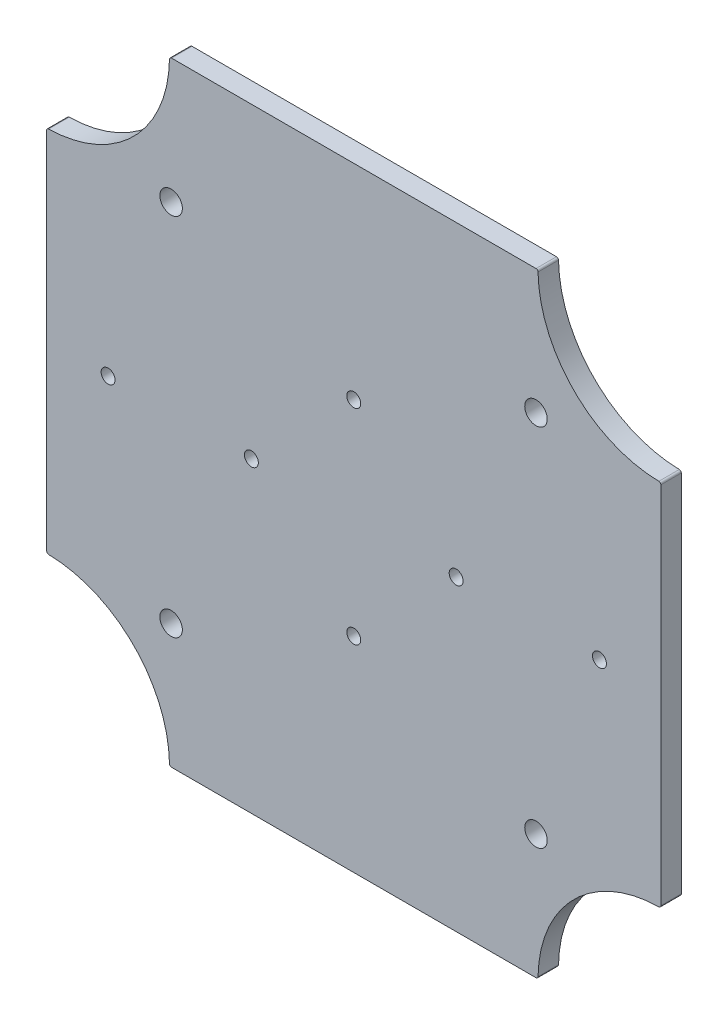
ISO-10303-21;
HEADER;
FILE_DESCRIPTION(('STEP AP214'),'2;1');
FILE_NAME('part.step','',(''),(''),'','','');
FILE_SCHEMA(('AUTOMOTIVE_DESIGN { 1 0 10303 214 1 1 1 1 }'));
ENDSEC;
DATA;
#1=APPLICATION_CONTEXT('core data for automotive mechanical design processes');
#2=APPLICATION_PROTOCOL_DEFINITION('international standard','automotive_design',2000,#1);
#3=PRODUCT_CONTEXT('',#1,'mechanical');
#4=PRODUCT('Part','Part','',(#3));
#5=PRODUCT_RELATED_PRODUCT_CATEGORY('part','',(#4));
#6=PRODUCT_DEFINITION_FORMATION('','',#4);
#7=PRODUCT_DEFINITION_CONTEXT('part definition',#1,'design');
#8=PRODUCT_DEFINITION('design','',#6,#7);
#9=PRODUCT_DEFINITION_SHAPE('','',#8);
#10=(LENGTH_UNIT() NAMED_UNIT(*) SI_UNIT(.MILLI.,.METRE.));
#11=(NAMED_UNIT(*) PLANE_ANGLE_UNIT() SI_UNIT($,.RADIAN.));
#12=(NAMED_UNIT(*) SI_UNIT($,.STERADIAN.) SOLID_ANGLE_UNIT());
#13=UNCERTAINTY_MEASURE_WITH_UNIT(LENGTH_MEASURE(1.E-05),#10,'distance_accuracy_value','');
#14=(GEOMETRIC_REPRESENTATION_CONTEXT(3) GLOBAL_UNCERTAINTY_ASSIGNED_CONTEXT((#13)) GLOBAL_UNIT_ASSIGNED_CONTEXT((#10,
#11,#12)) REPRESENTATION_CONTEXT('',''));
#15=CARTESIAN_POINT('',(0.,0.,0.));
#16=DIRECTION('',(0.,0.,1.));
#17=DIRECTION('',(1.,0.,0.));
#18=AXIS2_PLACEMENT_3D('',#15,#16,#17);
#19=CARTESIAN_POINT('',(0.,0.,0.));
#20=DIRECTION('',(0.,0.,1.));
#21=DIRECTION('',(1.,0.,0.));
#22=AXIS2_PLACEMENT_3D('',#19,#20,#21);
#23=PLANE('',#22);
#24=CARTESIAN_POINT('',(44.5040986360469,-44.612024131638,0.));
#25=DIRECTION('',(0.,0.,-1.));
#26=DIRECTION('',(0.,1.,0.));
#27=AXIS2_PLACEMENT_3D('',#24,#25,#26);
#28=CIRCLE('',#27,2.75);
#29=CARTESIAN_POINT('',(44.5040986360469,-41.862024131638,0.));
#30=VERTEX_POINT('',#29);
#31=EDGE_CURVE('E577',#30,#30,#28,.T.);
#32=ORIENTED_EDGE('',*,*,#31,.F.);
#33=EDGE_LOOP('',(#32));
#34=FACE_BOUND('',#33,.T.);
#35=CARTESIAN_POINT('',(-44.6120241316369,-44.6120241316387,0.));
#36=DIRECTION('',(0.,0.,-1.));
#37=DIRECTION('',(1.,0.,0.));
#38=AXIS2_PLACEMENT_3D('',#35,#36,#37);
#39=CIRCLE('',#38,2.75);
#40=CARTESIAN_POINT('',(-41.8620241316369,-44.6120241316387,0.));
#41=VERTEX_POINT('',#40);
#42=EDGE_CURVE('E583',#41,#41,#39,.T.);
#43=ORIENTED_EDGE('',*,*,#42,.F.);
#44=EDGE_LOOP('',(#43));
#45=FACE_BOUND('',#44,.T.);
#46=CARTESIAN_POINT('',(-44.6120241316374,44.5040986360458,0.));
#47=DIRECTION('',(0.,0.,-1.));
#48=DIRECTION('',(0.,-1.,0.));
#49=AXIS2_PLACEMENT_3D('',#46,#47,#48);
#50=CIRCLE('',#49,2.75);
#51=CARTESIAN_POINT('',(-44.6120241316374,41.7540986360458,0.));
#52=VERTEX_POINT('',#51);
#53=EDGE_CURVE('E591',#52,#52,#50,.T.);
#54=ORIENTED_EDGE('',*,*,#53,.F.);
#55=EDGE_LOOP('',(#54));
#56=FACE_BOUND('',#55,.T.);
#57=CARTESIAN_POINT('',(44.5040986360462,44.5040986360462,0.));
#58=DIRECTION('',(0.,0.,-1.));
#59=DIRECTION('',(-1.,0.,0.));
#60=AXIS2_PLACEMENT_3D('',#57,#58,#59);
#61=CIRCLE('',#60,2.75);
#62=CARTESIAN_POINT('',(41.7540986360462,44.5040986360462,0.));
#63=VERTEX_POINT('',#62);
#64=EDGE_CURVE('E581',#63,#63,#61,.T.);
#65=ORIENTED_EDGE('',*,*,#64,.F.);
#66=EDGE_LOOP('',(#65));
#67=FACE_BOUND('',#66,.T.);
#68=CARTESIAN_POINT('',(0.,25.,0.));
#69=DIRECTION('',(0.,0.,-1.));
#70=DIRECTION('',(-1.,0.,0.));
#71=AXIS2_PLACEMENT_3D('',#68,#69,#70);
#72=CIRCLE('',#71,1.69999999999999);
#73=CARTESIAN_POINT('',(-1.69999999999999,25.,0.));
#74=VERTEX_POINT('',#73);
#75=EDGE_CURVE('E598',#74,#74,#72,.T.);
#76=ORIENTED_EDGE('',*,*,#75,.F.);
#77=EDGE_LOOP('',(#76));
#78=FACE_BOUND('',#77,.T.);
#79=CARTESIAN_POINT('',(0.,-25.,0.));
#80=DIRECTION('',(0.,0.,-1.));
#81=DIRECTION('',(-1.,0.,0.));
#82=AXIS2_PLACEMENT_3D('',#79,#80,#81);
#83=CIRCLE('',#82,1.69999999999999);
#84=CARTESIAN_POINT('',(-1.69999999999999,-25.,0.));
#85=VERTEX_POINT('',#84);
#86=EDGE_CURVE('E605',#85,#85,#83,.T.);
#87=ORIENTED_EDGE('',*,*,#86,.F.);
#88=EDGE_LOOP('',(#87));
#89=FACE_BOUND('',#88,.T.);
#90=CARTESIAN_POINT('',(-59.9999999999987,0.,0.));
#91=DIRECTION('',(0.,0.,-1.));
#92=DIRECTION('',(-1.,0.,0.));
#93=AXIS2_PLACEMENT_3D('',#90,#91,#92);
#94=CIRCLE('',#93,1.69999999999999);
#95=CARTESIAN_POINT('',(-61.6999999999986,0.,0.));
#96=VERTEX_POINT('',#95);
#97=EDGE_CURVE('E611',#96,#96,#94,.T.);
#98=ORIENTED_EDGE('',*,*,#97,.F.);
#99=EDGE_LOOP('',(#98));
#100=FACE_BOUND('',#99,.T.);
#101=CARTESIAN_POINT('',(25.,0.,0.));
#102=DIRECTION('',(0.,0.,-1.));
#103=DIRECTION('',(-1.,0.,0.));
#104=AXIS2_PLACEMENT_3D('',#101,#102,#103);
#105=CIRCLE('',#104,1.69999999999999);
#106=CARTESIAN_POINT('',(23.3,0.,0.));
#107=VERTEX_POINT('',#106);
#108=EDGE_CURVE('E623',#107,#107,#105,.T.);
#109=ORIENTED_EDGE('',*,*,#108,.F.);
#110=EDGE_LOOP('',(#109));
#111=FACE_BOUND('',#110,.T.);
#112=CARTESIAN_POINT('',(60.0000000000028,0.,0.));
#113=DIRECTION('',(0.,0.,-1.));
#114=DIRECTION('',(-1.,0.,0.));
#115=AXIS2_PLACEMENT_3D('',#112,#113,#114);
#116=CIRCLE('',#115,1.69999999999999);
#117=CARTESIAN_POINT('',(58.3000000000028,0.,0.));
#118=VERTEX_POINT('',#117);
#119=EDGE_CURVE('E299',#118,#118,#116,.T.);
#120=ORIENTED_EDGE('',*,*,#119,.F.);
#121=EDGE_LOOP('',(#120));
#122=FACE_BOUND('',#121,.T.);
#123=CARTESIAN_POINT('',(75.,75.,0.));
#124=DIRECTION('',(0.,0.,1.));
#125=DIRECTION('',(1.,0.,0.));
#126=AXIS2_PLACEMENT_3D('',#123,#124,#125);
#127=CIRCLE('',#126,30.);
#128=CARTESIAN_POINT('',(74.5081967213114,45.0040314452913,0.));
#129=VERTEX_POINT('',#128);
#130=CARTESIAN_POINT('',(45.0040314452913,74.5081967213115,0.));
#131=VERTEX_POINT('',#130);
#132=EDGE_CURVE('E271',#129,#131,#127,.F.);
#133=ORIENTED_EDGE('',*,*,#132,.F.);
#134=CARTESIAN_POINT('',(74.5,44.5040986360462,0.));
#135=DIRECTION('',(0.,0.,1.));
#136=DIRECTION('',(1.,0.,0.));
#137=AXIS2_PLACEMENT_3D('',#134,#135,#136);
#138=CIRCLE('',#137,0.5);
#139=CARTESIAN_POINT('',(75.,44.5040986360462,0.));
#140=VERTEX_POINT('',#139);
#141=EDGE_CURVE('E216',#129,#140,#138,.F.);
#142=ORIENTED_EDGE('',*,*,#141,.T.);
#143=DIRECTION('',(0.,1.,0.));
#144=VECTOR('',#143,1.);
#145=CARTESIAN_POINT('',(75.,75.,0.));
#146=LINE('',#145,#144);
#147=CARTESIAN_POINT('',(75.,-44.5040986360448,0.));
#148=VERTEX_POINT('',#147);
#149=EDGE_CURVE('E272',#148,#140,#146,.T.);
#150=ORIENTED_EDGE('',*,*,#149,.F.);
#151=CARTESIAN_POINT('',(74.5,-44.5040986360448,0.));
#152=DIRECTION('',(0.,0.,1.));
#153=DIRECTION('',(1.,0.,0.));
#154=AXIS2_PLACEMENT_3D('',#151,#152,#153);
#155=CIRCLE('',#154,0.5);
#156=CARTESIAN_POINT('',(74.5081967213115,-45.00403144529,0.));
#157=VERTEX_POINT('',#156);
#158=EDGE_CURVE('E178',#148,#157,#155,.F.);
#159=ORIENTED_EDGE('',*,*,#158,.T.);
#160=CARTESIAN_POINT('',(75.0000000000028,-74.9999999999986,0.));
#161=DIRECTION('',(0.,0.,1.));
#162=DIRECTION('',(1.,0.,0.));
#163=AXIS2_PLACEMENT_3D('',#160,#161,#162);
#164=CIRCLE('',#163,30.);
#165=CARTESIAN_POINT('',(45.0040314452941,-74.5081967213114,0.));
#166=VERTEX_POINT('',#165);
#167=EDGE_CURVE('E246',#166,#157,#164,.F.);
#168=ORIENTED_EDGE('',*,*,#167,.F.);
#169=CARTESIAN_POINT('',(44.504098636049,-74.5,0.));
#170=DIRECTION('',(0.,0.,1.));
#171=DIRECTION('',(1.,0.,0.));
#172=AXIS2_PLACEMENT_3D('',#169,#170,#171);
#173=CIRCLE('',#172,0.5);
#174=CARTESIAN_POINT('',(44.504098636049,-75.,0.));
#175=VERTEX_POINT('',#174);
#176=EDGE_CURVE('E204',#166,#175,#173,.F.);
#177=ORIENTED_EDGE('',*,*,#176,.T.);
#178=DIRECTION('',(1.,0.,0.));
#179=VECTOR('',#178,1.);
#180=CARTESIAN_POINT('',(-75.,-75.,0.));
#181=LINE('',#180,#179);
#182=CARTESIAN_POINT('',(-44.504098636042,-75.,0.));
#183=VERTEX_POINT('',#182);
#184=EDGE_CURVE('E260',#183,#175,#181,.T.);
#185=ORIENTED_EDGE('',*,*,#184,.F.);
#186=CARTESIAN_POINT('',(-44.504098636042,-74.5,0.));
#187=DIRECTION('',(0.,0.,1.));
#188=DIRECTION('',(1.,0.,0.));
#189=AXIS2_PLACEMENT_3D('',#186,#187,#188);
#190=CIRCLE('',#189,0.5);
#191=CARTESIAN_POINT('',(-45.0040314452871,-74.5081967213115,0.));
#192=VERTEX_POINT('',#191);
#193=EDGE_CURVE('E53',#183,#192,#190,.F.);
#194=ORIENTED_EDGE('',*,*,#193,.T.);
#195=CARTESIAN_POINT('',(-74.9999999999958,-75.0000000000014,0.));
#196=DIRECTION('',(0.,0.,1.));
#197=DIRECTION('',(1.,0.,0.));
#198=AXIS2_PLACEMENT_3D('',#195,#196,#197);
#199=CIRCLE('',#198,30.);
#200=CARTESIAN_POINT('',(-74.5081967213114,-45.0040314452927,0.));
#201=VERTEX_POINT('',#200);
#202=EDGE_CURVE('E302',#201,#192,#199,.F.);
#203=ORIENTED_EDGE('',*,*,#202,.F.);
#204=CARTESIAN_POINT('',(-74.5,-44.5040986360476,0.));
#205=DIRECTION('',(0.,0.,1.));
#206=DIRECTION('',(1.,0.,0.));
#207=AXIS2_PLACEMENT_3D('',#204,#205,#206);
#208=CIRCLE('',#207,0.5);
#209=CARTESIAN_POINT('',(-75.,-44.5040986360476,0.));
#210=VERTEX_POINT('',#209);
#211=EDGE_CURVE('E208',#201,#210,#208,.F.);
#212=ORIENTED_EDGE('',*,*,#211,.T.);
#213=DIRECTION('',(0.,-1.,0.));
#214=VECTOR('',#213,1.);
#215=CARTESIAN_POINT('',(-75.,75.,0.));
#216=LINE('',#215,#214);
#217=CARTESIAN_POINT('',(-75.,44.5040986360433,0.));
#218=VERTEX_POINT('',#217);
#219=EDGE_CURVE('E268',#218,#210,#216,.T.);
#220=ORIENTED_EDGE('',*,*,#219,.F.);
#221=CARTESIAN_POINT('',(-74.5,44.5040986360433,0.));
#222=DIRECTION('',(0.,0.,1.));
#223=DIRECTION('',(1.,0.,0.));
#224=AXIS2_PLACEMENT_3D('',#221,#222,#223);
#225=CIRCLE('',#224,0.5);
#226=CARTESIAN_POINT('',(-74.5081967213115,45.0040314452885,0.));
#227=VERTEX_POINT('',#226);
#228=EDGE_CURVE('E210',#218,#227,#225,.F.);
#229=ORIENTED_EDGE('',*,*,#228,.T.);
#230=CARTESIAN_POINT('',(-74.9999999999986,74.9999999999972,0.));
#231=DIRECTION('',(0.,0.,1.));
#232=DIRECTION('',(1.,0.,0.));
#233=AXIS2_PLACEMENT_3D('',#230,#231,#232);
#234=CIRCLE('',#233,30.);
#235=CARTESIAN_POINT('',(-45.0040314452899,74.5081967213114,0.));
#236=VERTEX_POINT('',#235);
#237=EDGE_CURVE('E293',#236,#227,#234,.F.);
#238=ORIENTED_EDGE('',*,*,#237,.F.);
#239=CARTESIAN_POINT('',(-44.5040986360448,74.5,0.));
#240=DIRECTION('',(0.,0.,1.));
#241=DIRECTION('',(1.,0.,0.));
#242=AXIS2_PLACEMENT_3D('',#239,#240,#241);
#243=CIRCLE('',#242,0.5);
#244=CARTESIAN_POINT('',(-44.5040986360448,75.,0.));
#245=VERTEX_POINT('',#244);
#246=EDGE_CURVE('E212',#236,#245,#243,.F.);
#247=ORIENTED_EDGE('',*,*,#246,.T.);
#248=DIRECTION('',(-1.,0.,0.));
#249=VECTOR('',#248,1.);
#250=CARTESIAN_POINT('',(-75.,75.,0.));
#251=LINE('',#250,#249);
#252=CARTESIAN_POINT('',(44.5040986360462,75.,0.));
#253=VERTEX_POINT('',#252);
#254=EDGE_CURVE('E184',#253,#245,#251,.T.);
#255=ORIENTED_EDGE('',*,*,#254,.F.);
#256=CARTESIAN_POINT('',(44.5040986360462,74.5,0.));
#257=DIRECTION('',(0.,0.,1.));
#258=DIRECTION('',(1.,0.,0.));
#259=AXIS2_PLACEMENT_3D('',#256,#257,#258);
#260=CIRCLE('',#259,0.5);
#261=EDGE_CURVE('E214',#253,#131,#260,.F.);
#262=ORIENTED_EDGE('',*,*,#261,.T.);
#263=EDGE_LOOP('',(#133,#142,#150,#159,#168,#177,#185,#194,#203,#212,#220,#229,#238,#247,#255,#262));
#264=FACE_BOUND('',#263,.T.);
#265=CARTESIAN_POINT('',(-25.,0.,0.));
#266=DIRECTION('',(0.,0.,-1.));
#267=DIRECTION('',(-1.,0.,0.));
#268=AXIS2_PLACEMENT_3D('',#265,#266,#267);
#269=CIRCLE('',#268,1.69999999999999);
#270=CARTESIAN_POINT('',(-26.7,0.,0.));
#271=VERTEX_POINT('',#270);
#272=EDGE_CURVE('E617',#271,#271,#269,.T.);
#273=ORIENTED_EDGE('',*,*,#272,.F.);
#274=EDGE_LOOP('',(#273));
#275=FACE_BOUND('',#274,.T.);
#276=ADVANCED_FACE('F38',(#34,#45,#56,#67,#78,#89,#100,#111,#122,#264,#275),#23,.F.);
#277=CARTESIAN_POINT('',(-75.,75.,5.));
#278=DIRECTION('',(1.,0.,0.));
#279=DIRECTION('',(0.,1.,0.));
#280=AXIS2_PLACEMENT_3D('',#277,#278,#279);
#281=PLANE('',#280);
#282=DIRECTION('',(0.,-1.,0.));
#283=VECTOR('',#282,1.);
#284=CARTESIAN_POINT('',(-75.,75.,5.));
#285=LINE('',#284,#283);
#286=CARTESIAN_POINT('',(-75.,44.5040986360433,5.));
#287=VERTEX_POINT('',#286);
#288=CARTESIAN_POINT('',(-75.,-44.5040986360476,5.));
#289=VERTEX_POINT('',#288);
#290=EDGE_CURVE('E262',#287,#289,#285,.T.);
#291=ORIENTED_EDGE('',*,*,#290,.F.);
#292=DIRECTION('',(0.,0.,1.));
#293=VECTOR('',#292,1.);
#294=CARTESIAN_POINT('',(-75.,44.5040986360433,5.));
#295=LINE('',#294,#293);
#296=EDGE_CURVE('E231',#287,#218,#295,.F.);
#297=ORIENTED_EDGE('',*,*,#296,.T.);
#298=ORIENTED_EDGE('',*,*,#219,.T.);
#299=DIRECTION('',(0.,0.,1.));
#300=VECTOR('',#299,1.);
#301=CARTESIAN_POINT('',(-75.,-44.5040986360476,5.));
#302=LINE('',#301,#300);
#303=EDGE_CURVE('E228',#210,#289,#302,.T.);
#304=ORIENTED_EDGE('',*,*,#303,.T.);
#305=EDGE_LOOP('',(#291,#297,#298,#304));
#306=FACE_BOUND('',#305,.T.);
#307=ADVANCED_FACE('F328',(#306),#281,.F.);
#308=CARTESIAN_POINT('',(-75.,-75.,5.));
#309=DIRECTION('',(0.,1.,0.));
#310=DIRECTION('',(0.,0.,1.));
#311=AXIS2_PLACEMENT_3D('',#308,#309,#310);
#312=PLANE('',#311);
#313=DIRECTION('',(1.,0.,0.));
#314=VECTOR('',#313,1.);
#315=CARTESIAN_POINT('',(-75.,-75.,5.));
#316=LINE('',#315,#314);
#317=CARTESIAN_POINT('',(-44.504098636042,-75.,5.));
#318=VERTEX_POINT('',#317);
#319=CARTESIAN_POINT('',(44.504098636049,-75.,5.));
#320=VERTEX_POINT('',#319);
#321=EDGE_CURVE('E174',#318,#320,#316,.T.);
#322=ORIENTED_EDGE('',*,*,#321,.F.);
#323=DIRECTION('',(0.,0.,1.));
#324=VECTOR('',#323,1.);
#325=CARTESIAN_POINT('',(-44.504098636042,-75.,5.));
#326=LINE('',#325,#324);
#327=EDGE_CURVE('E240',#318,#183,#326,.F.);
#328=ORIENTED_EDGE('',*,*,#327,.T.);
#329=ORIENTED_EDGE('',*,*,#184,.T.);
#330=DIRECTION('',(0.,0.,1.));
#331=VECTOR('',#330,1.);
#332=CARTESIAN_POINT('',(44.504098636049,-75.,5.));
#333=LINE('',#332,#331);
#334=EDGE_CURVE('E237',#175,#320,#333,.T.);
#335=ORIENTED_EDGE('',*,*,#334,.T.);
#336=EDGE_LOOP('',(#322,#328,#329,#335));
#337=FACE_BOUND('',#336,.T.);
#338=ADVANCED_FACE('F258',(#337),#312,.F.);
#339=CARTESIAN_POINT('',(75.,75.,5.));
#340=DIRECTION('',(-1.,0.,0.));
#341=DIRECTION('',(0.,-1.,0.));
#342=AXIS2_PLACEMENT_3D('',#339,#340,#341);
#343=PLANE('',#342);
#344=ORIENTED_EDGE('',*,*,#149,.T.);
#345=DIRECTION('',(0.,0.,1.));
#346=VECTOR('',#345,1.);
#347=CARTESIAN_POINT('',(75.,44.5040986360462,5.));
#348=LINE('',#347,#346);
#349=CARTESIAN_POINT('',(75.,44.5040986360462,5.));
#350=VERTEX_POINT('',#349);
#351=EDGE_CURVE('E172',#140,#350,#348,.T.);
#352=ORIENTED_EDGE('',*,*,#351,.T.);
#353=DIRECTION('',(0.,1.,0.));
#354=VECTOR('',#353,1.);
#355=CARTESIAN_POINT('',(75.,75.,5.));
#356=LINE('',#355,#354);
#357=CARTESIAN_POINT('',(75.,-44.5040986360448,5.));
#358=VERTEX_POINT('',#357);
#359=EDGE_CURVE('E156',#358,#350,#356,.T.);
#360=ORIENTED_EDGE('',*,*,#359,.F.);
#361=DIRECTION('',(0.,0.,1.));
#362=VECTOR('',#361,1.);
#363=CARTESIAN_POINT('',(75.,-44.5040986360448,5.));
#364=LINE('',#363,#362);
#365=EDGE_CURVE('E169',#358,#148,#364,.F.);
#366=ORIENTED_EDGE('',*,*,#365,.T.);
#367=EDGE_LOOP('',(#344,#352,#360,#366));
#368=FACE_BOUND('',#367,.T.);
#369=ADVANCED_FACE('F168',(#368),#343,.F.);
#370=CARTESIAN_POINT('',(-75.,75.,5.));
#371=DIRECTION('',(0.,-1.,0.));
#372=DIRECTION('',(0.,0.,-1.));
#373=AXIS2_PLACEMENT_3D('',#370,#371,#372);
#374=PLANE('',#373);
#375=DIRECTION('',(-1.,0.,0.));
#376=VECTOR('',#375,1.);
#377=CARTESIAN_POINT('',(-75.,75.,5.));
#378=LINE('',#377,#376);
#379=CARTESIAN_POINT('',(44.5040986360462,75.,5.));
#380=VERTEX_POINT('',#379);
#381=CARTESIAN_POINT('',(-44.5040986360448,75.,5.));
#382=VERTEX_POINT('',#381);
#383=EDGE_CURVE('E173',#380,#382,#378,.T.);
#384=ORIENTED_EDGE('',*,*,#383,.F.);
#385=DIRECTION('',(0.,0.,1.));
#386=VECTOR('',#385,1.);
#387=CARTESIAN_POINT('',(44.5040986360462,75.,5.));
#388=LINE('',#387,#386);
#389=EDGE_CURVE('E221',#380,#253,#388,.F.);
#390=ORIENTED_EDGE('',*,*,#389,.T.);
#391=ORIENTED_EDGE('',*,*,#254,.T.);
#392=DIRECTION('',(0.,0.,1.));
#393=VECTOR('',#392,1.);
#394=CARTESIAN_POINT('',(-44.5040986360448,75.,5.));
#395=LINE('',#394,#393);
#396=EDGE_CURVE('E218',#245,#382,#395,.T.);
#397=ORIENTED_EDGE('',*,*,#396,.T.);
#398=EDGE_LOOP('',(#384,#390,#391,#397));
#399=FACE_BOUND('',#398,.T.);
#400=ADVANCED_FACE('F278',(#399),#374,.F.);
#401=CARTESIAN_POINT('',(0.,0.,5.));
#402=DIRECTION('',(0.,0.,1.));
#403=DIRECTION('',(1.,0.,0.));
#404=AXIS2_PLACEMENT_3D('',#401,#402,#403);
#405=PLANE('',#404);
#406=CARTESIAN_POINT('',(44.5040986360469,-44.612024131638,5.));
#407=DIRECTION('',(0.,0.,1.));
#408=DIRECTION('',(1.,0.,0.));
#409=AXIS2_PLACEMENT_3D('',#406,#407,#408);
#410=CIRCLE('',#409,2.75);
#411=CARTESIAN_POINT('',(47.2540986360469,-44.612024131638,5.));
#412=VERTEX_POINT('',#411);
#413=EDGE_CURVE('E575',#412,#412,#410,.F.);
#414=ORIENTED_EDGE('',*,*,#413,.T.);
#415=EDGE_LOOP('',(#414));
#416=FACE_BOUND('',#415,.T.);
#417=CARTESIAN_POINT('',(-44.6120241316369,-44.6120241316387,5.));
#418=DIRECTION('',(0.,0.,1.));
#419=DIRECTION('',(1.,0.,0.));
#420=AXIS2_PLACEMENT_3D('',#417,#418,#419);
#421=CIRCLE('',#420,2.75);
#422=CARTESIAN_POINT('',(-41.8620241316369,-44.6120241316387,5.));
#423=VERTEX_POINT('',#422);
#424=EDGE_CURVE('E588',#423,#423,#421,.F.);
#425=ORIENTED_EDGE('',*,*,#424,.T.);
#426=EDGE_LOOP('',(#425));
#427=FACE_BOUND('',#426,.T.);
#428=CARTESIAN_POINT('',(-44.6120241316374,44.5040986360458,5.));
#429=DIRECTION('',(0.,0.,1.));
#430=DIRECTION('',(1.,0.,0.));
#431=AXIS2_PLACEMENT_3D('',#428,#429,#430);
#432=CIRCLE('',#431,2.75);
#433=CARTESIAN_POINT('',(-41.8620241316374,44.5040986360458,5.));
#434=VERTEX_POINT('',#433);
#435=EDGE_CURVE('E594',#434,#434,#432,.F.);
#436=ORIENTED_EDGE('',*,*,#435,.T.);
#437=EDGE_LOOP('',(#436));
#438=FACE_BOUND('',#437,.T.);
#439=CARTESIAN_POINT('',(44.5040986360462,44.5040986360462,5.));
#440=DIRECTION('',(0.,0.,1.));
#441=DIRECTION('',(1.,0.,0.));
#442=AXIS2_PLACEMENT_3D('',#439,#440,#441);
#443=CIRCLE('',#442,2.75);
#444=CARTESIAN_POINT('',(47.2540986360462,44.5040986360462,5.));
#445=VERTEX_POINT('',#444);
#446=EDGE_CURVE('E578',#445,#445,#443,.F.);
#447=ORIENTED_EDGE('',*,*,#446,.T.);
#448=EDGE_LOOP('',(#447));
#449=FACE_BOUND('',#448,.T.);
#450=CARTESIAN_POINT('',(0.,25.,5.));
#451=DIRECTION('',(0.,0.,1.));
#452=DIRECTION('',(1.,0.,0.));
#453=AXIS2_PLACEMENT_3D('',#450,#451,#452);
#454=CIRCLE('',#453,1.69999999999999);
#455=CARTESIAN_POINT('',(1.69999999999999,25.,5.));
#456=VERTEX_POINT('',#455);
#457=EDGE_CURVE('E602',#456,#456,#454,.T.);
#458=ORIENTED_EDGE('',*,*,#457,.F.);
#459=EDGE_LOOP('',(#458));
#460=FACE_BOUND('',#459,.T.);
#461=CARTESIAN_POINT('',(0.,-25.,5.));
#462=DIRECTION('',(0.,0.,1.));
#463=DIRECTION('',(1.,0.,0.));
#464=AXIS2_PLACEMENT_3D('',#461,#462,#463);
#465=CIRCLE('',#464,1.69999999999999);
#466=CARTESIAN_POINT('',(1.69999999999999,-25.,5.));
#467=VERTEX_POINT('',#466);
#468=EDGE_CURVE('E608',#467,#467,#465,.T.);
#469=ORIENTED_EDGE('',*,*,#468,.F.);
#470=EDGE_LOOP('',(#469));
#471=FACE_BOUND('',#470,.T.);
#472=CARTESIAN_POINT('',(-59.9999999999987,0.,5.));
#473=DIRECTION('',(0.,0.,1.));
#474=DIRECTION('',(1.,0.,0.));
#475=AXIS2_PLACEMENT_3D('',#472,#473,#474);
#476=CIRCLE('',#475,1.69999999999999);
#477=CARTESIAN_POINT('',(-58.2999999999987,0.,5.));
#478=VERTEX_POINT('',#477);
#479=EDGE_CURVE('E614',#478,#478,#476,.T.);
#480=ORIENTED_EDGE('',*,*,#479,.F.);
#481=EDGE_LOOP('',(#480));
#482=FACE_BOUND('',#481,.T.);
#483=CARTESIAN_POINT('',(-25.,0.,5.));
#484=DIRECTION('',(0.,0.,1.));
#485=DIRECTION('',(1.,0.,0.));
#486=AXIS2_PLACEMENT_3D('',#483,#484,#485);
#487=CIRCLE('',#486,1.69999999999999);
#488=CARTESIAN_POINT('',(-23.3,0.,5.));
#489=VERTEX_POINT('',#488);
#490=EDGE_CURVE('E620',#489,#489,#487,.T.);
#491=ORIENTED_EDGE('',*,*,#490,.F.);
#492=EDGE_LOOP('',(#491));
#493=FACE_BOUND('',#492,.T.);
#494=CARTESIAN_POINT('',(25.,0.,5.));
#495=DIRECTION('',(0.,0.,1.));
#496=DIRECTION('',(1.,0.,0.));
#497=AXIS2_PLACEMENT_3D('',#494,#495,#496);
#498=CIRCLE('',#497,1.69999999999999);
#499=CARTESIAN_POINT('',(26.7,0.,5.));
#500=VERTEX_POINT('',#499);
#501=EDGE_CURVE('E626',#500,#500,#498,.T.);
#502=ORIENTED_EDGE('',*,*,#501,.F.);
#503=EDGE_LOOP('',(#502));
#504=FACE_BOUND('',#503,.T.);
#505=CARTESIAN_POINT('',(60.0000000000028,0.,5.));
#506=DIRECTION('',(0.,0.,1.));
#507=DIRECTION('',(1.,0.,0.));
#508=AXIS2_PLACEMENT_3D('',#505,#506,#507);
#509=CIRCLE('',#508,1.69999999999999);
#510=CARTESIAN_POINT('',(61.7000000000028,0.,5.));
#511=VERTEX_POINT('',#510);
#512=EDGE_CURVE('E294',#511,#511,#509,.T.);
#513=ORIENTED_EDGE('',*,*,#512,.F.);
#514=EDGE_LOOP('',(#513));
#515=FACE_BOUND('',#514,.T.);
#516=ORIENTED_EDGE('',*,*,#359,.T.);
#517=CARTESIAN_POINT('',(74.5,44.5040986360462,5.));
#518=DIRECTION('',(0.,0.,1.));
#519=DIRECTION('',(1.,0.,0.));
#520=AXIS2_PLACEMENT_3D('',#517,#518,#519);
#521=CIRCLE('',#520,0.5);
#522=CARTESIAN_POINT('',(74.5081967213114,45.0040314452913,5.));
#523=VERTEX_POINT('',#522);
#524=EDGE_CURVE('E197',#350,#523,#521,.T.);
#525=ORIENTED_EDGE('',*,*,#524,.T.);
#526=CARTESIAN_POINT('',(75.,75.,5.));
#527=DIRECTION('',(0.,0.,1.));
#528=DIRECTION('',(1.,0.,0.));
#529=AXIS2_PLACEMENT_3D('',#526,#527,#528);
#530=CIRCLE('',#529,30.);
#531=CARTESIAN_POINT('',(45.0040314452913,74.5081967213115,5.));
#532=VERTEX_POINT('',#531);
#533=EDGE_CURVE('E252',#532,#523,#530,.T.);
#534=ORIENTED_EDGE('',*,*,#533,.F.);
#535=CARTESIAN_POINT('',(44.5040986360462,74.5,5.));
#536=DIRECTION('',(0.,0.,1.));
#537=DIRECTION('',(1.,0.,0.));
#538=AXIS2_PLACEMENT_3D('',#535,#536,#537);
#539=CIRCLE('',#538,0.5);
#540=EDGE_CURVE('E195',#532,#380,#539,.T.);
#541=ORIENTED_EDGE('',*,*,#540,.T.);
#542=ORIENTED_EDGE('',*,*,#383,.T.);
#543=CARTESIAN_POINT('',(-44.5040986360448,74.5,5.));
#544=DIRECTION('',(0.,0.,1.));
#545=DIRECTION('',(1.,0.,0.));
#546=AXIS2_PLACEMENT_3D('',#543,#544,#545);
#547=CIRCLE('',#546,0.5);
#548=CARTESIAN_POINT('',(-45.0040314452899,74.5081967213114,5.));
#549=VERTEX_POINT('',#548);
#550=EDGE_CURVE('E193',#382,#549,#547,.T.);
#551=ORIENTED_EDGE('',*,*,#550,.T.);
#552=CARTESIAN_POINT('',(-74.9999999999986,74.9999999999972,5.));
#553=DIRECTION('',(0.,0.,1.));
#554=DIRECTION('',(1.,0.,0.));
#555=AXIS2_PLACEMENT_3D('',#552,#553,#554);
#556=CIRCLE('',#555,30.);
#557=CARTESIAN_POINT('',(-74.5081967213115,45.0040314452885,5.));
#558=VERTEX_POINT('',#557);
#559=EDGE_CURVE('E287',#558,#549,#556,.T.);
#560=ORIENTED_EDGE('',*,*,#559,.F.);
#561=CARTESIAN_POINT('',(-74.5,44.5040986360433,5.));
#562=DIRECTION('',(0.,0.,1.));
#563=DIRECTION('',(1.,0.,0.));
#564=AXIS2_PLACEMENT_3D('',#561,#562,#563);
#565=CIRCLE('',#564,0.5);
#566=EDGE_CURVE('E191',#558,#287,#565,.T.);
#567=ORIENTED_EDGE('',*,*,#566,.T.);
#568=ORIENTED_EDGE('',*,*,#290,.T.);
#569=CARTESIAN_POINT('',(-74.5,-44.5040986360476,5.));
#570=DIRECTION('',(0.,0.,1.));
#571=DIRECTION('',(1.,0.,0.));
#572=AXIS2_PLACEMENT_3D('',#569,#570,#571);
#573=CIRCLE('',#572,0.5);
#574=CARTESIAN_POINT('',(-74.5081967213114,-45.0040314452927,5.));
#575=VERTEX_POINT('',#574);
#576=EDGE_CURVE('E189',#289,#575,#573,.T.);
#577=ORIENTED_EDGE('',*,*,#576,.T.);
#578=CARTESIAN_POINT('',(-74.9999999999958,-75.0000000000014,5.));
#579=DIRECTION('',(0.,0.,1.));
#580=DIRECTION('',(1.,0.,0.));
#581=AXIS2_PLACEMENT_3D('',#578,#579,#580);
#582=CIRCLE('',#581,30.);
#583=CARTESIAN_POINT('',(-45.0040314452871,-74.5081967213115,5.));
#584=VERTEX_POINT('',#583);
#585=EDGE_CURVE('E296',#584,#575,#582,.T.);
#586=ORIENTED_EDGE('',*,*,#585,.F.);
#587=CARTESIAN_POINT('',(-44.504098636042,-74.5,5.));
#588=DIRECTION('',(0.,0.,1.));
#589=DIRECTION('',(1.,0.,0.));
#590=AXIS2_PLACEMENT_3D('',#587,#588,#589);
#591=CIRCLE('',#590,0.5);
#592=EDGE_CURVE('E162',#584,#318,#591,.T.);
#593=ORIENTED_EDGE('',*,*,#592,.T.);
#594=ORIENTED_EDGE('',*,*,#321,.T.);
#595=CARTESIAN_POINT('',(44.504098636049,-74.5,5.));
#596=DIRECTION('',(0.,0.,1.));
#597=DIRECTION('',(1.,0.,0.));
#598=AXIS2_PLACEMENT_3D('',#595,#596,#597);
#599=CIRCLE('',#598,0.5);
#600=CARTESIAN_POINT('',(45.0040314452941,-74.5081967213114,5.));
#601=VERTEX_POINT('',#600);
#602=EDGE_CURVE('E163',#320,#601,#599,.T.);
#603=ORIENTED_EDGE('',*,*,#602,.T.);
#604=CARTESIAN_POINT('',(75.0000000000028,-74.9999999999986,5.));
#605=DIRECTION('',(0.,0.,1.));
#606=DIRECTION('',(1.,0.,0.));
#607=AXIS2_PLACEMENT_3D('',#604,#605,#606);
#608=CIRCLE('',#607,30.);
#609=CARTESIAN_POINT('',(74.5081967213115,-45.00403144529,5.));
#610=VERTEX_POINT('',#609);
#611=EDGE_CURVE('E158',#610,#601,#608,.T.);
#612=ORIENTED_EDGE('',*,*,#611,.F.);
#613=CARTESIAN_POINT('',(74.5,-44.5040986360448,5.));
#614=DIRECTION('',(0.,0.,1.));
#615=DIRECTION('',(1.,0.,0.));
#616=AXIS2_PLACEMENT_3D('',#613,#614,#615);
#617=CIRCLE('',#616,0.5);
#618=EDGE_CURVE('E153',#610,#358,#617,.T.);
#619=ORIENTED_EDGE('',*,*,#618,.T.);
#620=EDGE_LOOP('',(#516,#525,#534,#541,#542,#551,#560,#567,#568,#577,#586,#593,#594,#603,#612,#619));
#621=FACE_BOUND('',#620,.T.);
#622=ADVANCED_FACE('F155',(#416,#427,#438,#449,#460,#471,#482,#493,#504,#515,#621),#405,.T.);
#623=CARTESIAN_POINT('',(75.,75.,-42.4264068711929));
#624=DIRECTION('',(0.,0.,1.));
#625=DIRECTION('',(1.,0.,0.));
#626=AXIS2_PLACEMENT_3D('',#623,#624,#625);
#627=CYLINDRICAL_SURFACE('',#626,30.);
#628=ORIENTED_EDGE('',*,*,#533,.T.);
#629=DIRECTION('',(0.,0.,1.));
#630=VECTOR('',#629,1.);
#631=CARTESIAN_POINT('',(74.5081967213114,45.0040314452913,-42.4264068711929));
#632=LINE('',#631,#630);
#633=EDGE_CURVE('E202',#523,#129,#632,.F.);
#634=ORIENTED_EDGE('',*,*,#633,.T.);
#635=ORIENTED_EDGE('',*,*,#132,.T.);
#636=DIRECTION('',(0.,0.,1.));
#637=VECTOR('',#636,1.);
#638=CARTESIAN_POINT('',(45.0040314452913,74.5081967213115,-42.4264068711929));
#639=LINE('',#638,#637);
#640=EDGE_CURVE('E199',#131,#532,#639,.T.);
#641=ORIENTED_EDGE('',*,*,#640,.T.);
#642=EDGE_LOOP('',(#628,#634,#635,#641));
#643=FACE_BOUND('',#642,.T.);
#644=ADVANCED_FACE('F310',(#643),#627,.F.);
#645=CARTESIAN_POINT('',(75.0000000000028,-74.9999999999986,-42.4264068711929));
#646=DIRECTION('',(0.,0.,1.));
#647=DIRECTION('',(1.,0.,0.));
#648=AXIS2_PLACEMENT_3D('',#645,#646,#647);
#649=CYLINDRICAL_SURFACE('',#648,30.);
#650=ORIENTED_EDGE('',*,*,#167,.T.);
#651=DIRECTION('',(0.,0.,1.));
#652=VECTOR('',#651,1.);
#653=CARTESIAN_POINT('',(74.5081967213115,-45.00403144529,-42.4264068711929));
#654=LINE('',#653,#652);
#655=EDGE_CURVE('E11',#157,#610,#654,.T.);
#656=ORIENTED_EDGE('',*,*,#655,.T.);
#657=ORIENTED_EDGE('',*,*,#611,.T.);
#658=DIRECTION('',(0.,0.,1.));
#659=VECTOR('',#658,1.);
#660=CARTESIAN_POINT('',(45.0040314452941,-74.5081967213114,-42.4264068711929));
#661=LINE('',#660,#659);
#662=EDGE_CURVE('E46',#601,#166,#661,.F.);
#663=ORIENTED_EDGE('',*,*,#662,.T.);
#664=EDGE_LOOP('',(#650,#656,#657,#663));
#665=FACE_BOUND('',#664,.T.);
#666=ADVANCED_FACE('F245',(#665),#649,.F.);
#667=CARTESIAN_POINT('',(-74.9999999999958,-75.0000000000014,-42.4264068711929));
#668=DIRECTION('',(0.,0.,1.));
#669=DIRECTION('',(1.,0.,0.));
#670=AXIS2_PLACEMENT_3D('',#667,#668,#669);
#671=CYLINDRICAL_SURFACE('',#670,30.);
#672=ORIENTED_EDGE('',*,*,#585,.T.);
#673=DIRECTION('',(0.,0.,1.));
#674=VECTOR('',#673,1.);
#675=CARTESIAN_POINT('',(-74.5081967213114,-45.0040314452927,-42.4264068711929));
#676=LINE('',#675,#674);
#677=EDGE_CURVE('E60',#575,#201,#676,.F.);
#678=ORIENTED_EDGE('',*,*,#677,.T.);
#679=ORIENTED_EDGE('',*,*,#202,.T.);
#680=DIRECTION('',(0.,0.,1.));
#681=VECTOR('',#680,1.);
#682=CARTESIAN_POINT('',(-45.0040314452871,-74.5081967213115,-42.4264068711929));
#683=LINE('',#682,#681);
#684=EDGE_CURVE('E233',#192,#584,#683,.T.);
#685=ORIENTED_EDGE('',*,*,#684,.T.);
#686=EDGE_LOOP('',(#672,#678,#679,#685));
#687=FACE_BOUND('',#686,.T.);
#688=ADVANCED_FACE('F376',(#687),#671,.F.);
#689=CARTESIAN_POINT('',(-74.9999999999986,74.9999999999972,-42.4264068711929));
#690=DIRECTION('',(0.,0.,1.));
#691=DIRECTION('',(1.,0.,0.));
#692=AXIS2_PLACEMENT_3D('',#689,#690,#691);
#693=CYLINDRICAL_SURFACE('',#692,30.);
#694=ORIENTED_EDGE('',*,*,#559,.T.);
#695=DIRECTION('',(0.,0.,1.));
#696=VECTOR('',#695,1.);
#697=CARTESIAN_POINT('',(-45.0040314452899,74.5081967213114,-42.4264068711929));
#698=LINE('',#697,#696);
#699=EDGE_CURVE('E226',#549,#236,#698,.F.);
#700=ORIENTED_EDGE('',*,*,#699,.T.);
#701=ORIENTED_EDGE('',*,*,#237,.T.);
#702=DIRECTION('',(0.,0.,1.));
#703=VECTOR('',#702,1.);
#704=CARTESIAN_POINT('',(-74.5081967213115,45.0040314452885,-42.4264068711929));
#705=LINE('',#704,#703);
#706=EDGE_CURVE('E223',#227,#558,#705,.T.);
#707=ORIENTED_EDGE('',*,*,#706,.T.);
#708=EDGE_LOOP('',(#694,#700,#701,#707));
#709=FACE_BOUND('',#708,.T.);
#710=ADVANCED_FACE('F289',(#709),#693,.F.);
#711=CARTESIAN_POINT('',(60.0000000000028,0.,0.));
#712=DIRECTION('',(0.,0.,-1.));
#713=DIRECTION('',(-1.,0.,0.));
#714=AXIS2_PLACEMENT_3D('',#711,#712,#713);
#715=CYLINDRICAL_SURFACE('',#714,1.69999999999999);
#716=ORIENTED_EDGE('',*,*,#119,.T.);
#717=EDGE_LOOP('',(#716));
#718=FACE_BOUND('',#717,.T.);
#719=ORIENTED_EDGE('',*,*,#512,.T.);
#720=EDGE_LOOP('',(#719));
#721=FACE_BOUND('',#720,.T.);
#722=ADVANCED_FACE('F389',(#718,#721),#715,.F.);
#723=CARTESIAN_POINT('',(25.,0.,0.));
#724=DIRECTION('',(0.,0.,-1.));
#725=DIRECTION('',(-1.,0.,0.));
#726=AXIS2_PLACEMENT_3D('',#723,#724,#725);
#727=CYLINDRICAL_SURFACE('',#726,1.69999999999999);
#728=ORIENTED_EDGE('',*,*,#108,.T.);
#729=EDGE_LOOP('',(#728));
#730=FACE_BOUND('',#729,.T.);
#731=ORIENTED_EDGE('',*,*,#501,.T.);
#732=EDGE_LOOP('',(#731));
#733=FACE_BOUND('',#732,.T.);
#734=ADVANCED_FACE('F397',(#730,#733),#727,.F.);
#735=CARTESIAN_POINT('',(-25.,0.,0.));
#736=DIRECTION('',(0.,0.,-1.));
#737=DIRECTION('',(-1.,0.,0.));
#738=AXIS2_PLACEMENT_3D('',#735,#736,#737);
#739=CYLINDRICAL_SURFACE('',#738,1.69999999999999);
#740=ORIENTED_EDGE('',*,*,#272,.T.);
#741=EDGE_LOOP('',(#740));
#742=FACE_BOUND('',#741,.T.);
#743=ORIENTED_EDGE('',*,*,#490,.T.);
#744=EDGE_LOOP('',(#743));
#745=FACE_BOUND('',#744,.T.);
#746=ADVANCED_FACE('F405',(#742,#745),#739,.F.);
#747=CARTESIAN_POINT('',(-59.9999999999987,0.,0.));
#748=DIRECTION('',(0.,0.,-1.));
#749=DIRECTION('',(-1.,0.,0.));
#750=AXIS2_PLACEMENT_3D('',#747,#748,#749);
#751=CYLINDRICAL_SURFACE('',#750,1.69999999999999);
#752=ORIENTED_EDGE('',*,*,#97,.T.);
#753=EDGE_LOOP('',(#752));
#754=FACE_BOUND('',#753,.T.);
#755=ORIENTED_EDGE('',*,*,#479,.T.);
#756=EDGE_LOOP('',(#755));
#757=FACE_BOUND('',#756,.T.);
#758=ADVANCED_FACE('F413',(#754,#757),#751,.F.);
#759=CARTESIAN_POINT('',(0.,-25.,0.));
#760=DIRECTION('',(0.,0.,-1.));
#761=DIRECTION('',(-1.,0.,0.));
#762=AXIS2_PLACEMENT_3D('',#759,#760,#761);
#763=CYLINDRICAL_SURFACE('',#762,1.69999999999999);
#764=ORIENTED_EDGE('',*,*,#86,.T.);
#765=EDGE_LOOP('',(#764));
#766=FACE_BOUND('',#765,.T.);
#767=ORIENTED_EDGE('',*,*,#468,.T.);
#768=EDGE_LOOP('',(#767));
#769=FACE_BOUND('',#768,.T.);
#770=ADVANCED_FACE('F421',(#766,#769),#763,.F.);
#771=CARTESIAN_POINT('',(0.,25.,0.));
#772=DIRECTION('',(0.,0.,-1.));
#773=DIRECTION('',(-1.,0.,0.));
#774=AXIS2_PLACEMENT_3D('',#771,#772,#773);
#775=CYLINDRICAL_SURFACE('',#774,1.69999999999999);
#776=ORIENTED_EDGE('',*,*,#75,.T.);
#777=EDGE_LOOP('',(#776));
#778=FACE_BOUND('',#777,.T.);
#779=ORIENTED_EDGE('',*,*,#457,.T.);
#780=EDGE_LOOP('',(#779));
#781=FACE_BOUND('',#780,.T.);
#782=ADVANCED_FACE('F325',(#778,#781),#775,.F.);
#783=CARTESIAN_POINT('',(74.5,44.5040986360462,-42.4264068711929));
#784=DIRECTION('',(0.,0.,1.));
#785=DIRECTION('',(1.,0.,0.));
#786=AXIS2_PLACEMENT_3D('',#783,#784,#785);
#787=CYLINDRICAL_SURFACE('',#786,0.5);
#788=ORIENTED_EDGE('',*,*,#141,.F.);
#789=ORIENTED_EDGE('',*,*,#633,.F.);
#790=ORIENTED_EDGE('',*,*,#524,.F.);
#791=ORIENTED_EDGE('',*,*,#351,.F.);
#792=EDGE_LOOP('',(#788,#789,#790,#791));
#793=FACE_BOUND('',#792,.T.);
#794=ADVANCED_FACE('F314',(#793),#787,.T.);
#795=CARTESIAN_POINT('',(44.5040986360462,74.5,-42.4264068711929));
#796=DIRECTION('',(0.,0.,1.));
#797=DIRECTION('',(1.,0.,0.));
#798=AXIS2_PLACEMENT_3D('',#795,#796,#797);
#799=CYLINDRICAL_SURFACE('',#798,0.5);
#800=ORIENTED_EDGE('',*,*,#261,.F.);
#801=ORIENTED_EDGE('',*,*,#389,.F.);
#802=ORIENTED_EDGE('',*,*,#540,.F.);
#803=ORIENTED_EDGE('',*,*,#640,.F.);
#804=EDGE_LOOP('',(#800,#801,#802,#803));
#805=FACE_BOUND('',#804,.T.);
#806=ADVANCED_FACE('F316',(#805),#799,.T.);
#807=CARTESIAN_POINT('',(-44.5040986360448,74.5,-42.4264068711929));
#808=DIRECTION('',(0.,0.,1.));
#809=DIRECTION('',(1.,0.,0.));
#810=AXIS2_PLACEMENT_3D('',#807,#808,#809);
#811=CYLINDRICAL_SURFACE('',#810,0.5);
#812=ORIENTED_EDGE('',*,*,#246,.F.);
#813=ORIENTED_EDGE('',*,*,#699,.F.);
#814=ORIENTED_EDGE('',*,*,#550,.F.);
#815=ORIENTED_EDGE('',*,*,#396,.F.);
#816=EDGE_LOOP('',(#812,#813,#814,#815));
#817=FACE_BOUND('',#816,.T.);
#818=ADVANCED_FACE('F283',(#817),#811,.T.);
#819=CARTESIAN_POINT('',(-74.5,44.5040986360433,-42.4264068711929));
#820=DIRECTION('',(0.,0.,1.));
#821=DIRECTION('',(1.,0.,0.));
#822=AXIS2_PLACEMENT_3D('',#819,#820,#821);
#823=CYLINDRICAL_SURFACE('',#822,0.5);
#824=ORIENTED_EDGE('',*,*,#228,.F.);
#825=ORIENTED_EDGE('',*,*,#296,.F.);
#826=ORIENTED_EDGE('',*,*,#566,.F.);
#827=ORIENTED_EDGE('',*,*,#706,.F.);
#828=EDGE_LOOP('',(#824,#825,#826,#827));
#829=FACE_BOUND('',#828,.T.);
#830=ADVANCED_FACE('F323',(#829),#823,.T.);
#831=CARTESIAN_POINT('',(-74.5,-44.5040986360476,-42.4264068711929));
#832=DIRECTION('',(0.,0.,1.));
#833=DIRECTION('',(1.,0.,0.));
#834=AXIS2_PLACEMENT_3D('',#831,#832,#833);
#835=CYLINDRICAL_SURFACE('',#834,0.5);
#836=ORIENTED_EDGE('',*,*,#211,.F.);
#837=ORIENTED_EDGE('',*,*,#677,.F.);
#838=ORIENTED_EDGE('',*,*,#576,.F.);
#839=ORIENTED_EDGE('',*,*,#303,.F.);
#840=EDGE_LOOP('',(#836,#837,#838,#839));
#841=FACE_BOUND('',#840,.T.);
#842=ADVANCED_FACE('F459',(#841),#835,.T.);
#843=CARTESIAN_POINT('',(-44.504098636042,-74.5,-42.4264068711929));
#844=DIRECTION('',(0.,0.,1.));
#845=DIRECTION('',(1.,0.,0.));
#846=AXIS2_PLACEMENT_3D('',#843,#844,#845);
#847=CYLINDRICAL_SURFACE('',#846,0.5);
#848=ORIENTED_EDGE('',*,*,#193,.F.);
#849=ORIENTED_EDGE('',*,*,#327,.F.);
#850=ORIENTED_EDGE('',*,*,#592,.F.);
#851=ORIENTED_EDGE('',*,*,#684,.F.);
#852=EDGE_LOOP('',(#848,#849,#850,#851));
#853=FACE_BOUND('',#852,.T.);
#854=ADVANCED_FACE('F469',(#853),#847,.T.);
#855=CARTESIAN_POINT('',(74.5,-44.5040986360448,-42.4264068711929));
#856=DIRECTION('',(0.,0.,1.));
#857=DIRECTION('',(1.,0.,0.));
#858=AXIS2_PLACEMENT_3D('',#855,#856,#857);
#859=CYLINDRICAL_SURFACE('',#858,0.5);
#860=ORIENTED_EDGE('',*,*,#158,.F.);
#861=ORIENTED_EDGE('',*,*,#365,.F.);
#862=ORIENTED_EDGE('',*,*,#618,.F.);
#863=ORIENTED_EDGE('',*,*,#655,.F.);
#864=EDGE_LOOP('',(#860,#861,#862,#863));
#865=FACE_BOUND('',#864,.T.);
#866=ADVANCED_FACE('F177',(#865),#859,.T.);
#867=CARTESIAN_POINT('',(44.504098636049,-74.5,-42.4264068711929));
#868=DIRECTION('',(0.,0.,1.));
#869=DIRECTION('',(1.,0.,0.));
#870=AXIS2_PLACEMENT_3D('',#867,#868,#869);
#871=CYLINDRICAL_SURFACE('',#870,0.5);
#872=ORIENTED_EDGE('',*,*,#176,.F.);
#873=ORIENTED_EDGE('',*,*,#662,.F.);
#874=ORIENTED_EDGE('',*,*,#602,.F.);
#875=ORIENTED_EDGE('',*,*,#334,.F.);
#876=EDGE_LOOP('',(#872,#873,#874,#875));
#877=FACE_BOUND('',#876,.T.);
#878=ADVANCED_FACE('F40',(#877),#871,.T.);
#879=CARTESIAN_POINT('',(44.5040986360462,44.5040986360462,5.001));
#880=DIRECTION('',(0.,0.,-1.));
#881=DIRECTION('',(-1.,0.,0.));
#882=AXIS2_PLACEMENT_3D('',#879,#880,#881);
#883=CYLINDRICAL_SURFACE('',#882,2.75);
#884=ORIENTED_EDGE('',*,*,#446,.F.);
#885=EDGE_LOOP('',(#884));
#886=FACE_BOUND('',#885,.T.);
#887=ORIENTED_EDGE('',*,*,#64,.T.);
#888=EDGE_LOOP('',(#887));
#889=FACE_BOUND('',#888,.T.);
#890=ADVANCED_FACE('F495',(#886,#889),#883,.F.);
#891=CARTESIAN_POINT('',(-44.6120241316374,44.5040986360458,5.001));
#892=DIRECTION('',(0.,0.,-1.));
#893=DIRECTION('',(-1.,0.,0.));
#894=AXIS2_PLACEMENT_3D('',#891,#892,#893);
#895=CYLINDRICAL_SURFACE('',#894,2.75);
#896=ORIENTED_EDGE('',*,*,#435,.F.);
#897=EDGE_LOOP('',(#896));
#898=FACE_BOUND('',#897,.T.);
#899=ORIENTED_EDGE('',*,*,#53,.T.);
#900=EDGE_LOOP('',(#899));
#901=FACE_BOUND('',#900,.T.);
#902=ADVANCED_FACE('F502',(#898,#901),#895,.F.);
#903=CARTESIAN_POINT('',(-44.6120241316369,-44.6120241316387,5.001));
#904=DIRECTION('',(0.,0.,-1.));
#905=DIRECTION('',(-1.,0.,0.));
#906=AXIS2_PLACEMENT_3D('',#903,#904,#905);
#907=CYLINDRICAL_SURFACE('',#906,2.75);
#908=ORIENTED_EDGE('',*,*,#424,.F.);
#909=EDGE_LOOP('',(#908));
#910=FACE_BOUND('',#909,.T.);
#911=ORIENTED_EDGE('',*,*,#42,.T.);
#912=EDGE_LOOP('',(#911));
#913=FACE_BOUND('',#912,.T.);
#914=ADVANCED_FACE('F548',(#910,#913),#907,.F.);
#915=CARTESIAN_POINT('',(44.5040986360469,-44.612024131638,5.001));
#916=DIRECTION('',(0.,0.,-1.));
#917=DIRECTION('',(-1.,0.,0.));
#918=AXIS2_PLACEMENT_3D('',#915,#916,#917);
#919=CYLINDRICAL_SURFACE('',#918,2.75);
#920=ORIENTED_EDGE('',*,*,#413,.F.);
#921=EDGE_LOOP('',(#920));
#922=FACE_BOUND('',#921,.T.);
#923=ORIENTED_EDGE('',*,*,#31,.T.);
#924=EDGE_LOOP('',(#923));
#925=FACE_BOUND('',#924,.T.);
#926=ADVANCED_FACE('F555',(#922,#925),#919,.F.);
#927=CLOSED_SHELL('',(#276,#307,#338,#369,#400,#622,#644,#666,#688,#710,#722,#734,#746,#758,
#770,#782,#794,#806,#818,#830,#842,#854,#866,#878,#890,#902,#914,#926));
#928=MANIFOLD_SOLID_BREP('B2',#927);
#929=ADVANCED_BREP_SHAPE_REPRESENTATION('',(#18,#928),#14);
#930=SHAPE_DEFINITION_REPRESENTATION(#9,#929);
ENDSEC;
END-ISO-10303-21;
